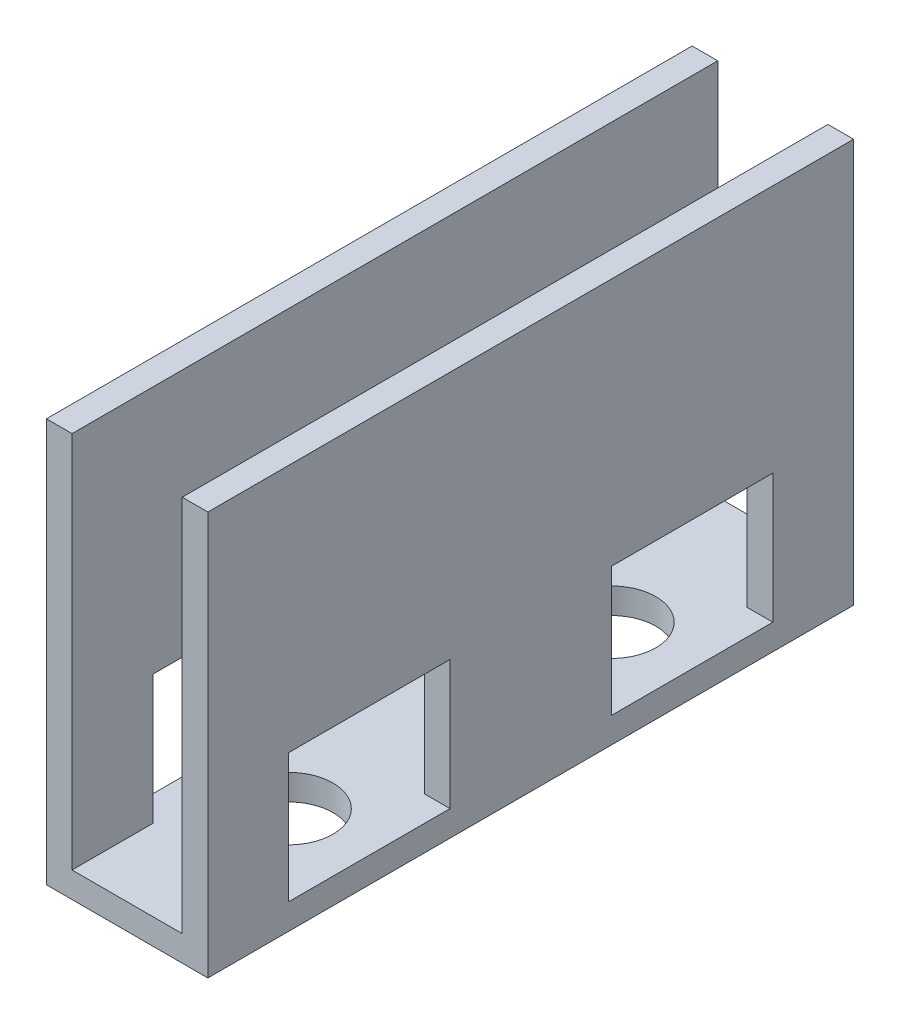
ISO-10303-21;
HEADER;
FILE_DESCRIPTION(('STEP AP214'),'2;1');
FILE_NAME('part.step','',(''),(''),'','','');
FILE_SCHEMA(('AUTOMOTIVE_DESIGN { 1 0 10303 214 1 1 1 1 }'));
ENDSEC;
DATA;
#1=APPLICATION_CONTEXT('core data for automotive mechanical design processes');
#2=APPLICATION_PROTOCOL_DEFINITION('international standard','automotive_design',2000,#1);
#3=PRODUCT_CONTEXT('',#1,'mechanical');
#4=PRODUCT('Part','Part','',(#3));
#5=PRODUCT_RELATED_PRODUCT_CATEGORY('part','',(#4));
#6=PRODUCT_DEFINITION_FORMATION('','',#4);
#7=PRODUCT_DEFINITION_CONTEXT('part definition',#1,'design');
#8=PRODUCT_DEFINITION('design','',#6,#7);
#9=PRODUCT_DEFINITION_SHAPE('','',#8);
#10=(LENGTH_UNIT() NAMED_UNIT(*) SI_UNIT(.MILLI.,.METRE.));
#11=(NAMED_UNIT(*) PLANE_ANGLE_UNIT() SI_UNIT($,.RADIAN.));
#12=(NAMED_UNIT(*) SI_UNIT($,.STERADIAN.) SOLID_ANGLE_UNIT());
#13=UNCERTAINTY_MEASURE_WITH_UNIT(LENGTH_MEASURE(1.E-05),#10,'distance_accuracy_value','');
#14=(GEOMETRIC_REPRESENTATION_CONTEXT(3) GLOBAL_UNCERTAINTY_ASSIGNED_CONTEXT((#13)) GLOBAL_UNIT_ASSIGNED_CONTEXT((#10,
#11,#12)) REPRESENTATION_CONTEXT('',''));
#15=CARTESIAN_POINT('',(0.,0.,0.));
#16=DIRECTION('',(0.,0.,1.));
#17=DIRECTION('',(1.,0.,0.));
#18=AXIS2_PLACEMENT_3D('',#15,#16,#17);
#19=CARTESIAN_POINT('',(0.,1.5875,0.));
#20=DIRECTION('',(0.,1.,0.));
#21=DIRECTION('',(0.,0.,1.));
#22=AXIS2_PLACEMENT_3D('',#19,#20,#21);
#23=PLANE('',#22);
#24=DIRECTION('',(0.,0.,1.));
#25=VECTOR('',#24,1.);
#26=CARTESIAN_POINT('',(-3.4125,1.5875,0.));
#27=LINE('',#26,#25);
#28=CARTESIAN_POINT('',(-3.4125,1.5875,-5.));
#29=VERTEX_POINT('',#28);
#30=CARTESIAN_POINT('',(-3.4125,1.5875,5.));
#31=VERTEX_POINT('',#30);
#32=EDGE_CURVE('E396',#29,#31,#27,.T.);
#33=ORIENTED_EDGE('',*,*,#32,.T.);
#34=DIRECTION('',(1.,0.,0.));
#35=VECTOR('',#34,1.);
#36=CARTESIAN_POINT('',(-5.,1.5875,5.));
#37=LINE('',#36,#35);
#38=CARTESIAN_POINT('',(-5.,1.5875,5.));
#39=VERTEX_POINT('',#38);
#40=EDGE_CURVE('E226',#39,#31,#37,.T.);
#41=ORIENTED_EDGE('',*,*,#40,.F.);
#42=DIRECTION('',(0.,0.,-1.));
#43=VECTOR('',#42,1.);
#44=CARTESIAN_POINT('',(-5.,1.5875,15.));
#45=LINE('',#44,#43);
#46=CARTESIAN_POINT('',(-5.,1.5875,15.));
#47=VERTEX_POINT('',#46);
#48=EDGE_CURVE('E223',#47,#39,#45,.T.);
#49=ORIENTED_EDGE('',*,*,#48,.F.);
#50=DIRECTION('',(1.,0.,0.));
#51=VECTOR('',#50,1.);
#52=CARTESIAN_POINT('',(-5.,1.5875,15.));
#53=LINE('',#52,#51);
#54=CARTESIAN_POINT('',(-3.4125,1.5875,15.));
#55=VERTEX_POINT('',#54);
#56=EDGE_CURVE('E206',#47,#55,#53,.T.);
#57=ORIENTED_EDGE('',*,*,#56,.T.);
#58=CARTESIAN_POINT('',(-3.4125,1.5875,20.));
#59=VERTEX_POINT('',#58);
#60=EDGE_CURVE('E390',#55,#59,#27,.T.);
#61=ORIENTED_EDGE('',*,*,#60,.T.);
#62=DIRECTION('',(1.,0.,0.));
#63=VECTOR('',#62,1.);
#64=CARTESIAN_POINT('',(0.,1.5875,20.));
#65=LINE('',#64,#63);
#66=CARTESIAN_POINT('',(3.4125,1.5875,20.));
#67=VERTEX_POINT('',#66);
#68=EDGE_CURVE('E397',#59,#67,#65,.T.);
#69=ORIENTED_EDGE('',*,*,#68,.T.);
#70=DIRECTION('',(0.,0.,1.));
#71=VECTOR('',#70,1.);
#72=CARTESIAN_POINT('',(3.4125,1.5875,0.));
#73=LINE('',#72,#71);
#74=CARTESIAN_POINT('',(3.4125,1.5875,15.));
#75=VERTEX_POINT('',#74);
#76=EDGE_CURVE('E361',#75,#67,#73,.T.);
#77=ORIENTED_EDGE('',*,*,#76,.F.);
#78=CARTESIAN_POINT('',(5.,1.5875,15.));
#79=VERTEX_POINT('',#78);
#80=EDGE_CURVE('E219',#75,#79,#53,.T.);
#81=ORIENTED_EDGE('',*,*,#80,.T.);
#82=DIRECTION('',(0.,0.,-1.));
#83=VECTOR('',#82,1.);
#84=CARTESIAN_POINT('',(5.,1.5875,15.));
#85=LINE('',#84,#83);
#86=CARTESIAN_POINT('',(5.,1.5875,5.));
#87=VERTEX_POINT('',#86);
#88=EDGE_CURVE('E250',#79,#87,#85,.T.);
#89=ORIENTED_EDGE('',*,*,#88,.T.);
#90=CARTESIAN_POINT('',(3.4125,1.5875,5.));
#91=VERTEX_POINT('',#90);
#92=EDGE_CURVE('E218',#91,#87,#37,.T.);
#93=ORIENTED_EDGE('',*,*,#92,.F.);
#94=CARTESIAN_POINT('',(3.4125,1.5875,-5.));
#95=VERTEX_POINT('',#94);
#96=EDGE_CURVE('E367',#95,#91,#73,.T.);
#97=ORIENTED_EDGE('',*,*,#96,.F.);
#98=DIRECTION('',(1.,0.,0.));
#99=VECTOR('',#98,1.);
#100=CARTESIAN_POINT('',(-5.,1.5875,-5.));
#101=LINE('',#100,#99);
#102=CARTESIAN_POINT('',(5.,1.5875,-5.));
#103=VERTEX_POINT('',#102);
#104=EDGE_CURVE('E283',#95,#103,#101,.T.);
#105=ORIENTED_EDGE('',*,*,#104,.T.);
#106=DIRECTION('',(0.,0.,-1.));
#107=VECTOR('',#106,1.);
#108=CARTESIAN_POINT('',(5.,1.5875,-15.));
#109=LINE('',#108,#107);
#110=CARTESIAN_POINT('',(5.,1.5875,-15.));
#111=VERTEX_POINT('',#110);
#112=EDGE_CURVE('E288',#103,#111,#109,.T.);
#113=ORIENTED_EDGE('',*,*,#112,.T.);
#114=DIRECTION('',(1.,0.,0.));
#115=VECTOR('',#114,1.);
#116=CARTESIAN_POINT('',(-5.,1.5875,-15.));
#117=LINE('',#116,#115);
#118=CARTESIAN_POINT('',(3.4125,1.5875,-15.));
#119=VERTEX_POINT('',#118);
#120=EDGE_CURVE('E287',#119,#111,#117,.T.);
#121=ORIENTED_EDGE('',*,*,#120,.F.);
#122=CARTESIAN_POINT('',(3.4125,1.5875,-20.));
#123=VERTEX_POINT('',#122);
#124=EDGE_CURVE('E362',#123,#119,#73,.T.);
#125=ORIENTED_EDGE('',*,*,#124,.F.);
#126=DIRECTION('',(1.,0.,0.));
#127=VECTOR('',#126,1.);
#128=CARTESIAN_POINT('',(0.,1.5875,-20.));
#129=LINE('',#128,#127);
#130=CARTESIAN_POINT('',(-3.4125,1.5875,-20.));
#131=VERTEX_POINT('',#130);
#132=EDGE_CURVE('E401',#131,#123,#129,.T.);
#133=ORIENTED_EDGE('',*,*,#132,.F.);
#134=CARTESIAN_POINT('',(-3.4125,1.5875,-15.));
#135=VERTEX_POINT('',#134);
#136=EDGE_CURVE('E391',#131,#135,#27,.T.);
#137=ORIENTED_EDGE('',*,*,#136,.T.);
#138=CARTESIAN_POINT('',(-5.,1.5875,-15.));
#139=VERTEX_POINT('',#138);
#140=EDGE_CURVE('E284',#139,#135,#117,.T.);
#141=ORIENTED_EDGE('',*,*,#140,.F.);
#142=DIRECTION('',(0.,0.,-1.));
#143=VECTOR('',#142,1.);
#144=CARTESIAN_POINT('',(-5.,1.5875,-15.));
#145=LINE('',#144,#143);
#146=CARTESIAN_POINT('',(-5.,1.5875,-5.));
#147=VERTEX_POINT('',#146);
#148=EDGE_CURVE('E272',#147,#139,#145,.T.);
#149=ORIENTED_EDGE('',*,*,#148,.F.);
#150=EDGE_CURVE('E279',#147,#29,#101,.T.);
#151=ORIENTED_EDGE('',*,*,#150,.T.);
#152=EDGE_LOOP('',(#33,#41,#49,#57,#61,#69,#77,#81,#89,#93,#97,#105,#113,#121,#125,#133,#137,
#141,#149,#151));
#153=FACE_BOUND('',#152,.T.);
#154=CARTESIAN_POINT('',(0.,1.5875,-10.));
#155=DIRECTION('',(0.,1.,0.));
#156=DIRECTION('',(0.,0.,1.));
#157=AXIS2_PLACEMENT_3D('',#154,#155,#156);
#158=CIRCLE('',#157,2.75);
#159=CARTESIAN_POINT('',(0.,1.5875,-7.25));
#160=VERTEX_POINT('',#159);
#161=EDGE_CURVE('E406',#160,#160,#158,.T.);
#162=ORIENTED_EDGE('',*,*,#161,.F.);
#163=EDGE_LOOP('',(#162));
#164=FACE_BOUND('',#163,.T.);
#165=CARTESIAN_POINT('',(0.,1.5875,10.));
#166=DIRECTION('',(0.,1.,0.));
#167=DIRECTION('',(0.,0.,1.));
#168=AXIS2_PLACEMENT_3D('',#165,#166,#167);
#169=CIRCLE('',#168,2.75);
#170=CARTESIAN_POINT('',(0.,1.5875,12.75));
#171=VERTEX_POINT('',#170);
#172=EDGE_CURVE('E410',#171,#171,#169,.T.);
#173=ORIENTED_EDGE('',*,*,#172,.F.);
#174=EDGE_LOOP('',(#173));
#175=FACE_BOUND('',#174,.T.);
#176=ADVANCED_FACE('F44',(#153,#164,#175),#23,.T.);
#177=CARTESIAN_POINT('',(0.,1.5875,20.));
#178=DIRECTION('',(0.,0.,-1.));
#179=DIRECTION('',(-1.,0.,0.));
#180=AXIS2_PLACEMENT_3D('',#177,#178,#179);
#181=PLANE('',#180);
#182=DIRECTION('',(1.,0.,0.));
#183=VECTOR('',#182,1.);
#184=CARTESIAN_POINT('',(0.,0.,20.));
#185=LINE('',#184,#183);
#186=CARTESIAN_POINT('',(-5.,0.,20.));
#187=VERTEX_POINT('',#186);
#188=CARTESIAN_POINT('',(5.,0.,20.));
#189=VERTEX_POINT('',#188);
#190=EDGE_CURVE('E395',#187,#189,#185,.T.);
#191=ORIENTED_EDGE('',*,*,#190,.T.);
#192=DIRECTION('',(0.,-1.,0.));
#193=VECTOR('',#192,1.);
#194=CARTESIAN_POINT('',(5.,1.5875,20.));
#195=LINE('',#194,#193);
#196=CARTESIAN_POINT('',(5.,25.,20.));
#197=VERTEX_POINT('',#196);
#198=EDGE_CURVE('E444',#197,#189,#195,.T.);
#199=ORIENTED_EDGE('',*,*,#198,.F.);
#200=DIRECTION('',(1.,0.,0.));
#201=VECTOR('',#200,1.);
#202=CARTESIAN_POINT('',(0.,25.,20.));
#203=LINE('',#202,#201);
#204=CARTESIAN_POINT('',(3.4125,25.,20.));
#205=VERTEX_POINT('',#204);
#206=EDGE_CURVE('E342',#205,#197,#203,.T.);
#207=ORIENTED_EDGE('',*,*,#206,.F.);
#208=DIRECTION('',(0.,-1.,0.));
#209=VECTOR('',#208,1.);
#210=CARTESIAN_POINT('',(3.4125,25.,20.));
#211=LINE('',#210,#209);
#212=EDGE_CURVE('E357',#205,#67,#211,.T.);
#213=ORIENTED_EDGE('',*,*,#212,.T.);
#214=ORIENTED_EDGE('',*,*,#68,.F.);
#215=DIRECTION('',(0.,-1.,0.));
#216=VECTOR('',#215,1.);
#217=CARTESIAN_POINT('',(-3.4125,25.,20.));
#218=LINE('',#217,#216);
#219=CARTESIAN_POINT('',(-3.4125,25.,20.));
#220=VERTEX_POINT('',#219);
#221=EDGE_CURVE('E386',#220,#59,#218,.T.);
#222=ORIENTED_EDGE('',*,*,#221,.F.);
#223=DIRECTION('',(1.,0.,0.));
#224=VECTOR('',#223,1.);
#225=CARTESIAN_POINT('',(0.,25.,20.));
#226=LINE('',#225,#224);
#227=CARTESIAN_POINT('',(-5.,25.,20.));
#228=VERTEX_POINT('',#227);
#229=EDGE_CURVE('E366',#228,#220,#226,.T.);
#230=ORIENTED_EDGE('',*,*,#229,.F.);
#231=DIRECTION('',(0.,-1.,0.));
#232=VECTOR('',#231,1.);
#233=CARTESIAN_POINT('',(-5.,1.5875,20.));
#234=LINE('',#233,#232);
#235=EDGE_CURVE('E414',#228,#187,#234,.T.);
#236=ORIENTED_EDGE('',*,*,#235,.T.);
#237=EDGE_LOOP('',(#191,#199,#207,#213,#214,#222,#230,#236));
#238=FACE_BOUND('',#237,.T.);
#239=ADVANCED_FACE('F46',(#238),#181,.F.);
#240=CARTESIAN_POINT('',(5.,1.5875,0.));
#241=DIRECTION('',(-1.,0.,0.));
#242=DIRECTION('',(0.,0.,1.));
#243=AXIS2_PLACEMENT_3D('',#240,#241,#242);
#244=PLANE('',#243);
#245=ORIENTED_EDGE('',*,*,#88,.F.);
#246=DIRECTION('',(0.,-1.,0.));
#247=VECTOR('',#246,1.);
#248=CARTESIAN_POINT('',(5.,1.5875,15.));
#249=LINE('',#248,#247);
#250=CARTESIAN_POINT('',(5.,9.5875,15.));
#251=VERTEX_POINT('',#250);
#252=EDGE_CURVE('E60',#251,#79,#249,.T.);
#253=ORIENTED_EDGE('',*,*,#252,.F.);
#254=DIRECTION('',(0.,0.,1.));
#255=VECTOR('',#254,1.);
#256=CARTESIAN_POINT('',(5.,9.5875,15.));
#257=LINE('',#256,#255);
#258=CARTESIAN_POINT('',(5.,9.5875,5.));
#259=VERTEX_POINT('',#258);
#260=EDGE_CURVE('E237',#259,#251,#257,.T.);
#261=ORIENTED_EDGE('',*,*,#260,.F.);
#262=DIRECTION('',(0.,1.,0.));
#263=VECTOR('',#262,1.);
#264=CARTESIAN_POINT('',(5.,1.5875,5.));
#265=LINE('',#264,#263);
#266=EDGE_CURVE('E241',#87,#259,#265,.T.);
#267=ORIENTED_EDGE('',*,*,#266,.F.);
#268=EDGE_LOOP('',(#245,#253,#261,#267));
#269=FACE_BOUND('',#268,.T.);
#270=DIRECTION('',(0.,0.,1.));
#271=VECTOR('',#270,1.);
#272=CARTESIAN_POINT('',(5.,9.5875,-15.));
#273=LINE('',#272,#271);
#274=CARTESIAN_POINT('',(5.,9.5875,-15.));
#275=VERTEX_POINT('',#274);
#276=CARTESIAN_POINT('',(5.,9.5875,-5.));
#277=VERTEX_POINT('',#276);
#278=EDGE_CURVE('E297',#275,#277,#273,.T.);
#279=ORIENTED_EDGE('',*,*,#278,.F.);
#280=DIRECTION('',(0.,1.,0.));
#281=VECTOR('',#280,1.);
#282=CARTESIAN_POINT('',(5.,1.5875,-15.));
#283=LINE('',#282,#281);
#284=EDGE_CURVE('E68',#111,#275,#283,.T.);
#285=ORIENTED_EDGE('',*,*,#284,.F.);
#286=ORIENTED_EDGE('',*,*,#112,.F.);
#287=DIRECTION('',(0.,-1.,0.));
#288=VECTOR('',#287,1.);
#289=CARTESIAN_POINT('',(5.,1.5875,-5.));
#290=LINE('',#289,#288);
#291=EDGE_CURVE('E292',#277,#103,#290,.T.);
#292=ORIENTED_EDGE('',*,*,#291,.F.);
#293=EDGE_LOOP('',(#279,#285,#286,#292));
#294=FACE_BOUND('',#293,.T.);
#295=DIRECTION('',(0.,0.,-1.));
#296=VECTOR('',#295,1.);
#297=CARTESIAN_POINT('',(5.,0.,0.));
#298=LINE('',#297,#296);
#299=CARTESIAN_POINT('',(5.,0.,-20.));
#300=VERTEX_POINT('',#299);
#301=EDGE_CURVE('E417',#189,#300,#298,.T.);
#302=ORIENTED_EDGE('',*,*,#301,.T.);
#303=DIRECTION('',(0.,-1.,0.));
#304=VECTOR('',#303,1.);
#305=CARTESIAN_POINT('',(5.,1.5875,-20.));
#306=LINE('',#305,#304);
#307=CARTESIAN_POINT('',(5.,25.,-20.));
#308=VERTEX_POINT('',#307);
#309=EDGE_CURVE('E440',#308,#300,#306,.T.);
#310=ORIENTED_EDGE('',*,*,#309,.F.);
#311=DIRECTION('',(0.,0.,-1.));
#312=VECTOR('',#311,1.);
#313=CARTESIAN_POINT('',(5.,25.,0.));
#314=LINE('',#313,#312);
#315=EDGE_CURVE('E346',#197,#308,#314,.T.);
#316=ORIENTED_EDGE('',*,*,#315,.F.);
#317=ORIENTED_EDGE('',*,*,#198,.T.);
#318=EDGE_LOOP('',(#302,#310,#316,#317));
#319=FACE_BOUND('',#318,.T.);
#320=ADVANCED_FACE('F510',(#269,#294,#319),#244,.F.);
#321=CARTESIAN_POINT('',(0.,1.5875,-20.));
#322=DIRECTION('',(0.,0.,-1.));
#323=DIRECTION('',(-1.,0.,0.));
#324=AXIS2_PLACEMENT_3D('',#321,#322,#323);
#325=PLANE('',#324);
#326=ORIENTED_EDGE('',*,*,#132,.T.);
#327=DIRECTION('',(0.,-1.,0.));
#328=VECTOR('',#327,1.);
#329=CARTESIAN_POINT('',(3.4125,25.,-20.));
#330=LINE('',#329,#328);
#331=CARTESIAN_POINT('',(3.4125,25.,-20.));
#332=VERTEX_POINT('',#331);
#333=EDGE_CURVE('E354',#332,#123,#330,.T.);
#334=ORIENTED_EDGE('',*,*,#333,.F.);
#335=DIRECTION('',(1.,0.,0.));
#336=VECTOR('',#335,1.);
#337=CARTESIAN_POINT('',(0.,25.,-20.));
#338=LINE('',#337,#336);
#339=EDGE_CURVE('E350',#332,#308,#338,.T.);
#340=ORIENTED_EDGE('',*,*,#339,.T.);
#341=ORIENTED_EDGE('',*,*,#309,.T.);
#342=DIRECTION('',(1.,0.,0.));
#343=VECTOR('',#342,1.);
#344=CARTESIAN_POINT('',(0.,0.,-20.));
#345=LINE('',#344,#343);
#346=CARTESIAN_POINT('',(-5.,0.,-20.));
#347=VERTEX_POINT('',#346);
#348=EDGE_CURVE('E421',#347,#300,#345,.T.);
#349=ORIENTED_EDGE('',*,*,#348,.F.);
#350=DIRECTION('',(0.,-1.,0.));
#351=VECTOR('',#350,1.);
#352=CARTESIAN_POINT('',(-5.,1.5875,-20.));
#353=LINE('',#352,#351);
#354=CARTESIAN_POINT('',(-5.,25.,-20.));
#355=VERTEX_POINT('',#354);
#356=EDGE_CURVE('E437',#355,#347,#353,.T.);
#357=ORIENTED_EDGE('',*,*,#356,.F.);
#358=DIRECTION('',(1.,0.,0.));
#359=VECTOR('',#358,1.);
#360=CARTESIAN_POINT('',(0.,25.,-20.));
#361=LINE('',#360,#359);
#362=CARTESIAN_POINT('',(-3.4125,25.,-20.));
#363=VERTEX_POINT('',#362);
#364=EDGE_CURVE('E374',#355,#363,#361,.T.);
#365=ORIENTED_EDGE('',*,*,#364,.T.);
#366=DIRECTION('',(0.,-1.,0.));
#367=VECTOR('',#366,1.);
#368=CARTESIAN_POINT('',(-3.4125,25.,-20.));
#369=LINE('',#368,#367);
#370=EDGE_CURVE('E382',#363,#131,#369,.T.);
#371=ORIENTED_EDGE('',*,*,#370,.T.);
#372=EDGE_LOOP('',(#326,#334,#340,#341,#349,#357,#365,#371));
#373=FACE_BOUND('',#372,.T.);
#374=ADVANCED_FACE('F512',(#373),#325,.T.);
#375=CARTESIAN_POINT('',(0.,1.5875,-10.));
#376=DIRECTION('',(0.,-1.,0.));
#377=DIRECTION('',(0.,0.,-1.));
#378=AXIS2_PLACEMENT_3D('',#375,#376,#377);
#379=CYLINDRICAL_SURFACE('',#378,2.75);
#380=ORIENTED_EDGE('',*,*,#161,.T.);
#381=EDGE_LOOP('',(#380));
#382=FACE_BOUND('',#381,.T.);
#383=CARTESIAN_POINT('',(0.,0.,-10.));
#384=DIRECTION('',(0.,1.,0.));
#385=DIRECTION('',(0.,0.,1.));
#386=AXIS2_PLACEMENT_3D('',#383,#384,#385);
#387=CIRCLE('',#386,2.75);
#388=CARTESIAN_POINT('',(0.,0.,-7.25));
#389=VERTEX_POINT('',#388);
#390=EDGE_CURVE('E428',#389,#389,#387,.T.);
#391=ORIENTED_EDGE('',*,*,#390,.F.);
#392=EDGE_LOOP('',(#391));
#393=FACE_BOUND('',#392,.T.);
#394=ADVANCED_FACE('F560',(#382,#393),#379,.F.);
#395=CARTESIAN_POINT('',(-5.,1.5875,0.));
#396=DIRECTION('',(-1.,0.,0.));
#397=DIRECTION('',(0.,0.,1.));
#398=AXIS2_PLACEMENT_3D('',#395,#396,#397);
#399=PLANE('',#398);
#400=DIRECTION('',(0.,-1.,0.));
#401=VECTOR('',#400,1.);
#402=CARTESIAN_POINT('',(-5.,1.5875,15.));
#403=LINE('',#402,#401);
#404=CARTESIAN_POINT('',(-5.,9.5875,15.));
#405=VERTEX_POINT('',#404);
#406=EDGE_CURVE('E211',#405,#47,#403,.T.);
#407=ORIENTED_EDGE('',*,*,#406,.T.);
#408=ORIENTED_EDGE('',*,*,#48,.T.);
#409=DIRECTION('',(0.,1.,0.));
#410=VECTOR('',#409,1.);
#411=CARTESIAN_POINT('',(-5.,1.5875,5.));
#412=LINE('',#411,#410);
#413=CARTESIAN_POINT('',(-5.,9.5875,5.));
#414=VERTEX_POINT('',#413);
#415=EDGE_CURVE('E230',#39,#414,#412,.T.);
#416=ORIENTED_EDGE('',*,*,#415,.T.);
#417=DIRECTION('',(0.,0.,1.));
#418=VECTOR('',#417,1.);
#419=CARTESIAN_POINT('',(-5.,9.5875,15.));
#420=LINE('',#419,#418);
#421=EDGE_CURVE('E235',#414,#405,#420,.T.);
#422=ORIENTED_EDGE('',*,*,#421,.T.);
#423=EDGE_LOOP('',(#407,#408,#416,#422));
#424=FACE_BOUND('',#423,.T.);
#425=DIRECTION('',(0.,1.,0.));
#426=VECTOR('',#425,1.);
#427=CARTESIAN_POINT('',(-5.,1.5875,-15.));
#428=LINE('',#427,#426);
#429=CARTESIAN_POINT('',(-5.,9.5875,-15.));
#430=VERTEX_POINT('',#429);
#431=EDGE_CURVE('E293',#139,#430,#428,.T.);
#432=ORIENTED_EDGE('',*,*,#431,.T.);
#433=DIRECTION('',(0.,0.,1.));
#434=VECTOR('',#433,1.);
#435=CARTESIAN_POINT('',(-5.,9.5875,-15.));
#436=LINE('',#435,#434);
#437=CARTESIAN_POINT('',(-5.,9.5875,-5.));
#438=VERTEX_POINT('',#437);
#439=EDGE_CURVE('E310',#430,#438,#436,.T.);
#440=ORIENTED_EDGE('',*,*,#439,.T.);
#441=DIRECTION('',(0.,-1.,0.));
#442=VECTOR('',#441,1.);
#443=CARTESIAN_POINT('',(-5.,1.5875,-5.));
#444=LINE('',#443,#442);
#445=EDGE_CURVE('E306',#438,#147,#444,.T.);
#446=ORIENTED_EDGE('',*,*,#445,.T.);
#447=ORIENTED_EDGE('',*,*,#148,.T.);
#448=EDGE_LOOP('',(#432,#440,#446,#447));
#449=FACE_BOUND('',#448,.T.);
#450=DIRECTION('',(0.,0.,-1.));
#451=VECTOR('',#450,1.);
#452=CARTESIAN_POINT('',(-5.,0.,0.));
#453=LINE('',#452,#451);
#454=EDGE_CURVE('E424',#187,#347,#453,.T.);
#455=ORIENTED_EDGE('',*,*,#454,.F.);
#456=ORIENTED_EDGE('',*,*,#235,.F.);
#457=DIRECTION('',(0.,0.,-1.));
#458=VECTOR('',#457,1.);
#459=CARTESIAN_POINT('',(-5.,25.,0.));
#460=LINE('',#459,#458);
#461=EDGE_CURVE('E378',#228,#355,#460,.T.);
#462=ORIENTED_EDGE('',*,*,#461,.T.);
#463=ORIENTED_EDGE('',*,*,#356,.T.);
#464=EDGE_LOOP('',(#455,#456,#462,#463));
#465=FACE_BOUND('',#464,.T.);
#466=ADVANCED_FACE('F232',(#424,#449,#465),#399,.T.);
#467=CARTESIAN_POINT('',(0.,1.5875,10.));
#468=DIRECTION('',(0.,-1.,0.));
#469=DIRECTION('',(0.,0.,-1.));
#470=AXIS2_PLACEMENT_3D('',#467,#468,#469);
#471=CYLINDRICAL_SURFACE('',#470,2.75);
#472=ORIENTED_EDGE('',*,*,#172,.T.);
#473=EDGE_LOOP('',(#472));
#474=FACE_BOUND('',#473,.T.);
#475=CARTESIAN_POINT('',(0.,0.,10.));
#476=DIRECTION('',(0.,1.,0.));
#477=DIRECTION('',(0.,0.,1.));
#478=AXIS2_PLACEMENT_3D('',#475,#476,#477);
#479=CIRCLE('',#478,2.75);
#480=CARTESIAN_POINT('',(0.,0.,12.75));
#481=VERTEX_POINT('',#480);
#482=EDGE_CURVE('E402',#481,#481,#479,.T.);
#483=ORIENTED_EDGE('',*,*,#482,.F.);
#484=EDGE_LOOP('',(#483));
#485=FACE_BOUND('',#484,.T.);
#486=ADVANCED_FACE('F556',(#474,#485),#471,.F.);
#487=CARTESIAN_POINT('',(0.,0.,0.));
#488=DIRECTION('',(0.,1.,0.));
#489=DIRECTION('',(0.,0.,1.));
#490=AXIS2_PLACEMENT_3D('',#487,#488,#489);
#491=PLANE('',#490);
#492=ORIENTED_EDGE('',*,*,#348,.T.);
#493=ORIENTED_EDGE('',*,*,#301,.F.);
#494=ORIENTED_EDGE('',*,*,#190,.F.);
#495=ORIENTED_EDGE('',*,*,#454,.T.);
#496=EDGE_LOOP('',(#492,#493,#494,#495));
#497=FACE_BOUND('',#496,.T.);
#498=ORIENTED_EDGE('',*,*,#482,.T.);
#499=EDGE_LOOP('',(#498));
#500=FACE_BOUND('',#499,.T.);
#501=ORIENTED_EDGE('',*,*,#390,.T.);
#502=EDGE_LOOP('',(#501));
#503=FACE_BOUND('',#502,.T.);
#504=ADVANCED_FACE('F502',(#497,#500,#503),#491,.F.);
#505=CARTESIAN_POINT('',(-3.4125,25.,0.));
#506=DIRECTION('',(-1.,0.,0.));
#507=DIRECTION('',(0.,0.,1.));
#508=AXIS2_PLACEMENT_3D('',#505,#506,#507);
#509=PLANE('',#508);
#510=ORIENTED_EDGE('',*,*,#60,.F.);
#511=DIRECTION('',(0.,1.,0.));
#512=VECTOR('',#511,1.);
#513=CARTESIAN_POINT('',(-3.4125,25.,15.));
#514=LINE('',#513,#512);
#515=CARTESIAN_POINT('',(-3.4125,9.5875,15.));
#516=VERTEX_POINT('',#515);
#517=EDGE_CURVE('E214',#55,#516,#514,.T.);
#518=ORIENTED_EDGE('',*,*,#517,.T.);
#519=DIRECTION('',(0.,0.,-1.));
#520=VECTOR('',#519,1.);
#521=CARTESIAN_POINT('',(-3.4125,9.5875,0.));
#522=LINE('',#521,#520);
#523=CARTESIAN_POINT('',(-3.4125,9.5875,5.));
#524=VERTEX_POINT('',#523);
#525=EDGE_CURVE('E332',#516,#524,#522,.T.);
#526=ORIENTED_EDGE('',*,*,#525,.T.);
#527=DIRECTION('',(0.,-1.,0.));
#528=VECTOR('',#527,1.);
#529=CARTESIAN_POINT('',(-3.4125,25.,5.));
#530=LINE('',#529,#528);
#531=EDGE_CURVE('E328',#524,#31,#530,.T.);
#532=ORIENTED_EDGE('',*,*,#531,.T.);
#533=ORIENTED_EDGE('',*,*,#32,.F.);
#534=DIRECTION('',(0.,1.,0.));
#535=VECTOR('',#534,1.);
#536=CARTESIAN_POINT('',(-3.4125,25.,-5.));
#537=LINE('',#536,#535);
#538=CARTESIAN_POINT('',(-3.4125,9.5875,-5.));
#539=VERTEX_POINT('',#538);
#540=EDGE_CURVE('E320',#29,#539,#537,.T.);
#541=ORIENTED_EDGE('',*,*,#540,.T.);
#542=DIRECTION('',(0.,0.,-1.));
#543=VECTOR('',#542,1.);
#544=CARTESIAN_POINT('',(-3.4125,9.5875,0.));
#545=LINE('',#544,#543);
#546=CARTESIAN_POINT('',(-3.4125,9.5875,-15.));
#547=VERTEX_POINT('',#546);
#548=EDGE_CURVE('E260',#539,#547,#545,.T.);
#549=ORIENTED_EDGE('',*,*,#548,.T.);
#550=DIRECTION('',(0.,-1.,0.));
#551=VECTOR('',#550,1.);
#552=CARTESIAN_POINT('',(-3.4125,25.,-15.));
#553=LINE('',#552,#551);
#554=EDGE_CURVE('E324',#547,#135,#553,.T.);
#555=ORIENTED_EDGE('',*,*,#554,.T.);
#556=ORIENTED_EDGE('',*,*,#136,.F.);
#557=ORIENTED_EDGE('',*,*,#370,.F.);
#558=DIRECTION('',(0.,0.,-1.));
#559=VECTOR('',#558,1.);
#560=CARTESIAN_POINT('',(-3.4125,25.,0.));
#561=LINE('',#560,#559);
#562=EDGE_CURVE('E371',#220,#363,#561,.T.);
#563=ORIENTED_EDGE('',*,*,#562,.F.);
#564=ORIENTED_EDGE('',*,*,#221,.T.);
#565=EDGE_LOOP('',(#510,#518,#526,#532,#533,#541,#549,#555,#556,#557,#563,#564));
#566=FACE_BOUND('',#565,.T.);
#567=ADVANCED_FACE('F490',(#566),#509,.F.);
#568=CARTESIAN_POINT('',(0.,25.,0.));
#569=DIRECTION('',(0.,1.,0.));
#570=DIRECTION('',(0.,0.,1.));
#571=AXIS2_PLACEMENT_3D('',#568,#569,#570);
#572=PLANE('',#571);
#573=ORIENTED_EDGE('',*,*,#229,.T.);
#574=ORIENTED_EDGE('',*,*,#562,.T.);
#575=ORIENTED_EDGE('',*,*,#364,.F.);
#576=ORIENTED_EDGE('',*,*,#461,.F.);
#577=EDGE_LOOP('',(#573,#574,#575,#576));
#578=FACE_BOUND('',#577,.T.);
#579=ADVANCED_FACE('F497',(#578),#572,.T.);
#580=CARTESIAN_POINT('',(3.4125,25.,0.));
#581=DIRECTION('',(-1.,0.,0.));
#582=DIRECTION('',(0.,0.,1.));
#583=AXIS2_PLACEMENT_3D('',#580,#581,#582);
#584=PLANE('',#583);
#585=DIRECTION('',(0.,1.,0.));
#586=VECTOR('',#585,1.);
#587=CARTESIAN_POINT('',(3.4125,25.,15.));
#588=LINE('',#587,#586);
#589=CARTESIAN_POINT('',(3.4125,9.5875,15.));
#590=VERTEX_POINT('',#589);
#591=EDGE_CURVE('E11',#75,#590,#588,.T.);
#592=ORIENTED_EDGE('',*,*,#591,.F.);
#593=ORIENTED_EDGE('',*,*,#76,.T.);
#594=ORIENTED_EDGE('',*,*,#212,.F.);
#595=DIRECTION('',(0.,0.,-1.));
#596=VECTOR('',#595,1.);
#597=CARTESIAN_POINT('',(3.4125,25.,0.));
#598=LINE('',#597,#596);
#599=EDGE_CURVE('E338',#205,#332,#598,.T.);
#600=ORIENTED_EDGE('',*,*,#599,.T.);
#601=ORIENTED_EDGE('',*,*,#333,.T.);
#602=ORIENTED_EDGE('',*,*,#124,.T.);
#603=DIRECTION('',(0.,-1.,0.));
#604=VECTOR('',#603,1.);
#605=CARTESIAN_POINT('',(3.4125,25.,-15.));
#606=LINE('',#605,#604);
#607=CARTESIAN_POINT('',(3.4125,9.5875,-15.));
#608=VERTEX_POINT('',#607);
#609=EDGE_CURVE('E455',#608,#119,#606,.T.);
#610=ORIENTED_EDGE('',*,*,#609,.F.);
#611=DIRECTION('',(0.,0.,-1.));
#612=VECTOR('',#611,1.);
#613=CARTESIAN_POINT('',(3.4125,9.5875,0.));
#614=LINE('',#613,#612);
#615=CARTESIAN_POINT('',(3.4125,9.5875,-5.));
#616=VERTEX_POINT('',#615);
#617=EDGE_CURVE('E448',#616,#608,#614,.T.);
#618=ORIENTED_EDGE('',*,*,#617,.F.);
#619=DIRECTION('',(0.,1.,0.));
#620=VECTOR('',#619,1.);
#621=CARTESIAN_POINT('',(3.4125,25.,-5.));
#622=LINE('',#621,#620);
#623=EDGE_CURVE('E451',#95,#616,#622,.T.);
#624=ORIENTED_EDGE('',*,*,#623,.F.);
#625=ORIENTED_EDGE('',*,*,#96,.T.);
#626=DIRECTION('',(0.,-1.,0.));
#627=VECTOR('',#626,1.);
#628=CARTESIAN_POINT('',(3.4125,25.,5.));
#629=LINE('',#628,#627);
#630=CARTESIAN_POINT('',(3.4125,9.5875,5.));
#631=VERTEX_POINT('',#630);
#632=EDGE_CURVE('E458',#631,#91,#629,.T.);
#633=ORIENTED_EDGE('',*,*,#632,.F.);
#634=DIRECTION('',(0.,0.,-1.));
#635=VECTOR('',#634,1.);
#636=CARTESIAN_POINT('',(3.4125,9.5875,0.));
#637=LINE('',#636,#635);
#638=EDGE_CURVE('E53',#590,#631,#637,.T.);
#639=ORIENTED_EDGE('',*,*,#638,.F.);
#640=EDGE_LOOP('',(#592,#593,#594,#600,#601,#602,#610,#618,#624,#625,#633,#639));
#641=FACE_BOUND('',#640,.T.);
#642=ADVANCED_FACE('F476',(#641),#584,.T.);
#643=CARTESIAN_POINT('',(0.,25.,0.));
#644=DIRECTION('',(0.,1.,0.));
#645=DIRECTION('',(0.,0.,1.));
#646=AXIS2_PLACEMENT_3D('',#643,#644,#645);
#647=PLANE('',#646);
#648=ORIENTED_EDGE('',*,*,#599,.F.);
#649=ORIENTED_EDGE('',*,*,#206,.T.);
#650=ORIENTED_EDGE('',*,*,#315,.T.);
#651=ORIENTED_EDGE('',*,*,#339,.F.);
#652=EDGE_LOOP('',(#648,#649,#650,#651));
#653=FACE_BOUND('',#652,.T.);
#654=ADVANCED_FACE('F508',(#653),#647,.T.);
#655=CARTESIAN_POINT('',(-5.,9.5875,-15.));
#656=DIRECTION('',(0.,1.,0.));
#657=DIRECTION('',(0.,0.,1.));
#658=AXIS2_PLACEMENT_3D('',#655,#656,#657);
#659=PLANE('',#658);
#660=ORIENTED_EDGE('',*,*,#617,.T.);
#661=DIRECTION('',(1.,0.,0.));
#662=VECTOR('',#661,1.);
#663=CARTESIAN_POINT('',(-5.,9.5875,-15.));
#664=LINE('',#663,#662);
#665=EDGE_CURVE('E273',#608,#275,#664,.T.);
#666=ORIENTED_EDGE('',*,*,#665,.T.);
#667=ORIENTED_EDGE('',*,*,#278,.T.);
#668=DIRECTION('',(1.,0.,0.));
#669=VECTOR('',#668,1.);
#670=CARTESIAN_POINT('',(-5.,9.5875,-5.));
#671=LINE('',#670,#669);
#672=EDGE_CURVE('E278',#616,#277,#671,.T.);
#673=ORIENTED_EDGE('',*,*,#672,.F.);
#674=EDGE_LOOP('',(#660,#666,#667,#673));
#675=FACE_BOUND('',#674,.T.);
#676=ADVANCED_FACE('F524',(#675),#659,.F.);
#677=CARTESIAN_POINT('',(-5.,1.5875,-5.));
#678=DIRECTION('',(0.,0.,1.));
#679=DIRECTION('',(1.,0.,0.));
#680=AXIS2_PLACEMENT_3D('',#677,#678,#679);
#681=PLANE('',#680);
#682=ORIENTED_EDGE('',*,*,#623,.T.);
#683=ORIENTED_EDGE('',*,*,#672,.T.);
#684=ORIENTED_EDGE('',*,*,#291,.T.);
#685=ORIENTED_EDGE('',*,*,#104,.F.);
#686=EDGE_LOOP('',(#682,#683,#684,#685));
#687=FACE_BOUND('',#686,.T.);
#688=ADVANCED_FACE('F528',(#687),#681,.F.);
#689=CARTESIAN_POINT('',(-5.,1.5875,-15.));
#690=DIRECTION('',(0.,0.,-1.));
#691=DIRECTION('',(0.,1.,0.));
#692=AXIS2_PLACEMENT_3D('',#689,#690,#691);
#693=PLANE('',#692);
#694=ORIENTED_EDGE('',*,*,#609,.T.);
#695=ORIENTED_EDGE('',*,*,#120,.T.);
#696=ORIENTED_EDGE('',*,*,#284,.T.);
#697=ORIENTED_EDGE('',*,*,#665,.F.);
#698=EDGE_LOOP('',(#694,#695,#696,#697));
#699=FACE_BOUND('',#698,.T.);
#700=ADVANCED_FACE('F529',(#699),#693,.F.);
#701=CARTESIAN_POINT('',(-5.,1.5875,5.));
#702=DIRECTION('',(0.,0.,-1.));
#703=DIRECTION('',(-1.,0.,0.));
#704=AXIS2_PLACEMENT_3D('',#701,#702,#703);
#705=PLANE('',#704);
#706=ORIENTED_EDGE('',*,*,#632,.T.);
#707=ORIENTED_EDGE('',*,*,#92,.T.);
#708=ORIENTED_EDGE('',*,*,#266,.T.);
#709=DIRECTION('',(1.,0.,0.));
#710=VECTOR('',#709,1.);
#711=CARTESIAN_POINT('',(-5.,9.5875,5.));
#712=LINE('',#711,#710);
#713=EDGE_CURVE('E266',#631,#259,#712,.T.);
#714=ORIENTED_EDGE('',*,*,#713,.F.);
#715=EDGE_LOOP('',(#706,#707,#708,#714));
#716=FACE_BOUND('',#715,.T.);
#717=ADVANCED_FACE('F471',(#716),#705,.F.);
#718=CARTESIAN_POINT('',(-5.,9.5875,15.));
#719=DIRECTION('',(0.,1.,0.));
#720=DIRECTION('',(0.,0.,1.));
#721=AXIS2_PLACEMENT_3D('',#718,#719,#720);
#722=PLANE('',#721);
#723=ORIENTED_EDGE('',*,*,#638,.T.);
#724=ORIENTED_EDGE('',*,*,#713,.T.);
#725=ORIENTED_EDGE('',*,*,#260,.T.);
#726=DIRECTION('',(1.,0.,0.));
#727=VECTOR('',#726,1.);
#728=CARTESIAN_POINT('',(-5.,9.5875,15.));
#729=LINE('',#728,#727);
#730=EDGE_CURVE('E261',#590,#251,#729,.T.);
#731=ORIENTED_EDGE('',*,*,#730,.F.);
#732=EDGE_LOOP('',(#723,#724,#725,#731));
#733=FACE_BOUND('',#732,.T.);
#734=ADVANCED_FACE('F466',(#733),#722,.F.);
#735=CARTESIAN_POINT('',(-5.,1.5875,15.));
#736=DIRECTION('',(0.,0.,1.));
#737=DIRECTION('',(0.,-1.,0.));
#738=AXIS2_PLACEMENT_3D('',#735,#736,#737);
#739=PLANE('',#738);
#740=ORIENTED_EDGE('',*,*,#591,.T.);
#741=ORIENTED_EDGE('',*,*,#730,.T.);
#742=ORIENTED_EDGE('',*,*,#252,.T.);
#743=ORIENTED_EDGE('',*,*,#80,.F.);
#744=EDGE_LOOP('',(#740,#741,#742,#743));
#745=FACE_BOUND('',#744,.T.);
#746=ADVANCED_FACE('F544',(#745),#739,.F.);
#747=EDGE_CURVE('E269',#430,#547,#664,.T.);
#748=ORIENTED_EDGE('',*,*,#747,.F.);
#749=ORIENTED_EDGE('',*,*,#431,.F.);
#750=ORIENTED_EDGE('',*,*,#140,.T.);
#751=ORIENTED_EDGE('',*,*,#554,.F.);
#752=EDGE_LOOP('',(#748,#749,#750,#751));
#753=FACE_BOUND('',#752,.T.);
#754=ADVANCED_FACE('F532',(#753),#693,.F.);
#755=ORIENTED_EDGE('',*,*,#150,.F.);
#756=ORIENTED_EDGE('',*,*,#445,.F.);
#757=EDGE_CURVE('E274',#438,#539,#671,.T.);
#758=ORIENTED_EDGE('',*,*,#757,.T.);
#759=ORIENTED_EDGE('',*,*,#540,.F.);
#760=EDGE_LOOP('',(#755,#756,#758,#759));
#761=FACE_BOUND('',#760,.T.);
#762=ADVANCED_FACE('F540',(#761),#681,.F.);
#763=ORIENTED_EDGE('',*,*,#757,.F.);
#764=ORIENTED_EDGE('',*,*,#439,.F.);
#765=ORIENTED_EDGE('',*,*,#747,.T.);
#766=ORIENTED_EDGE('',*,*,#548,.F.);
#767=EDGE_LOOP('',(#763,#764,#765,#766));
#768=FACE_BOUND('',#767,.T.);
#769=ADVANCED_FACE('F582',(#768),#659,.F.);
#770=ORIENTED_EDGE('',*,*,#56,.F.);
#771=ORIENTED_EDGE('',*,*,#406,.F.);
#772=EDGE_CURVE('E257',#405,#516,#729,.T.);
#773=ORIENTED_EDGE('',*,*,#772,.T.);
#774=ORIENTED_EDGE('',*,*,#517,.F.);
#775=EDGE_LOOP('',(#770,#771,#773,#774));
#776=FACE_BOUND('',#775,.T.);
#777=ADVANCED_FACE('F208',(#776),#739,.F.);
#778=ORIENTED_EDGE('',*,*,#772,.F.);
#779=ORIENTED_EDGE('',*,*,#421,.F.);
#780=EDGE_CURVE('E262',#414,#524,#712,.T.);
#781=ORIENTED_EDGE('',*,*,#780,.T.);
#782=ORIENTED_EDGE('',*,*,#525,.F.);
#783=EDGE_LOOP('',(#778,#779,#781,#782));
#784=FACE_BOUND('',#783,.T.);
#785=ADVANCED_FACE('F580',(#784),#722,.F.);
#786=ORIENTED_EDGE('',*,*,#780,.F.);
#787=ORIENTED_EDGE('',*,*,#415,.F.);
#788=ORIENTED_EDGE('',*,*,#40,.T.);
#789=ORIENTED_EDGE('',*,*,#531,.F.);
#790=EDGE_LOOP('',(#786,#787,#788,#789));
#791=FACE_BOUND('',#790,.T.);
#792=ADVANCED_FACE('F538',(#791),#705,.F.);
#793=CLOSED_SHELL('',(#176,#239,#320,#374,#394,#466,#486,#504,#567,#579,#642,#654,#676,#688,
#700,#717,#734,#746,#754,#762,#769,#777,#785,#792));
#794=MANIFOLD_SOLID_BREP('B2',#793);
#795=ADVANCED_BREP_SHAPE_REPRESENTATION('',(#18,#794),#14);
#796=SHAPE_DEFINITION_REPRESENTATION(#9,#795);
ENDSEC;
END-ISO-10303-21;
